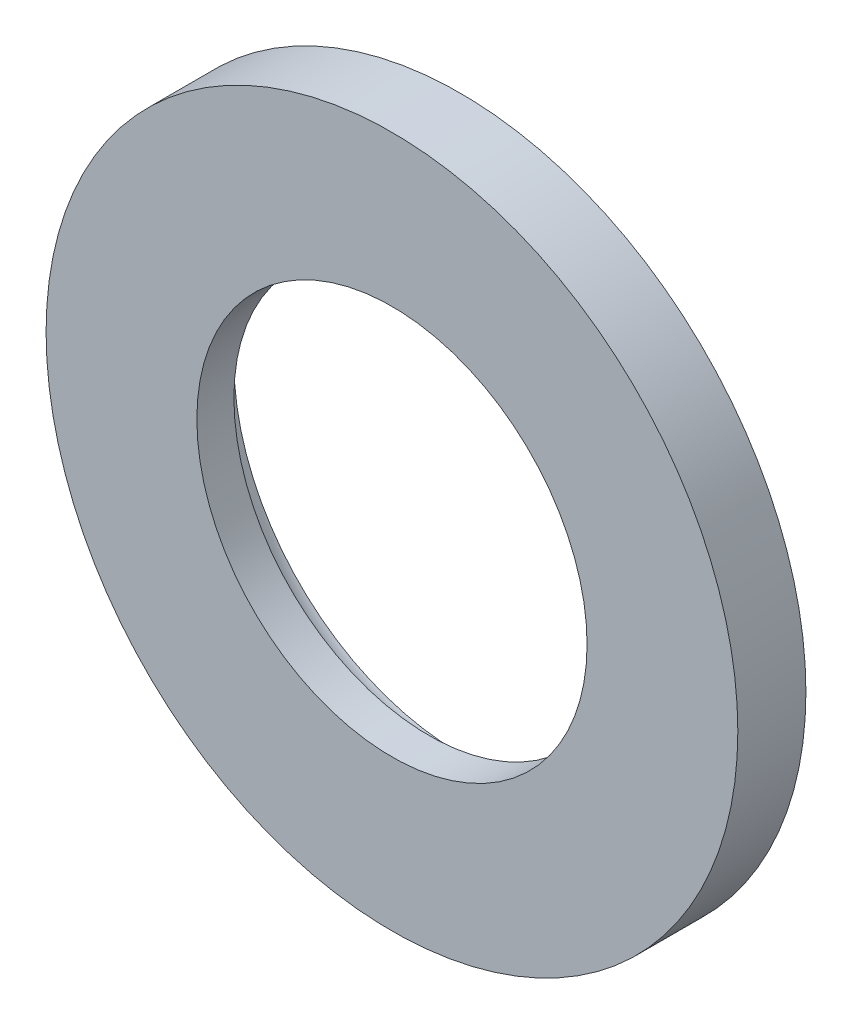
ISO-10303-21;
HEADER;
FILE_DESCRIPTION(('STEP AP214'),'2;1');
FILE_NAME('part.step','',(''),(''),'','','');
FILE_SCHEMA(('AUTOMOTIVE_DESIGN { 1 0 10303 214 1 1 1 1 }'));
ENDSEC;
DATA;
#1=APPLICATION_CONTEXT('core data for automotive mechanical design processes');
#2=APPLICATION_PROTOCOL_DEFINITION('international standard','automotive_design',2000,#1);
#3=PRODUCT_CONTEXT('',#1,'mechanical');
#4=PRODUCT('Part','Part','',(#3));
#5=PRODUCT_RELATED_PRODUCT_CATEGORY('part','',(#4));
#6=PRODUCT_DEFINITION_FORMATION('','',#4);
#7=PRODUCT_DEFINITION_CONTEXT('part definition',#1,'design');
#8=PRODUCT_DEFINITION('design','',#6,#7);
#9=PRODUCT_DEFINITION_SHAPE('','',#8);
#10=(LENGTH_UNIT() NAMED_UNIT(*) SI_UNIT(.MILLI.,.METRE.));
#11=(NAMED_UNIT(*) PLANE_ANGLE_UNIT() SI_UNIT($,.RADIAN.));
#12=(NAMED_UNIT(*) SI_UNIT($,.STERADIAN.) SOLID_ANGLE_UNIT());
#13=UNCERTAINTY_MEASURE_WITH_UNIT(LENGTH_MEASURE(1.E-05),#10,'distance_accuracy_value','');
#14=(GEOMETRIC_REPRESENTATION_CONTEXT(3) GLOBAL_UNCERTAINTY_ASSIGNED_CONTEXT((#13)) GLOBAL_UNIT_ASSIGNED_CONTEXT((#10,
#11,#12)) REPRESENTATION_CONTEXT('',''));
#15=CARTESIAN_POINT('',(0.,0.,0.));
#16=DIRECTION('',(0.,0.,1.));
#17=DIRECTION('',(1.,0.,0.));
#18=AXIS2_PLACEMENT_3D('',#15,#16,#17);
#19=CARTESIAN_POINT('',(0.,0.,-1.95));
#20=DIRECTION('',(0.,0.,1.));
#21=DIRECTION('',(1.,0.,0.));
#22=AXIS2_PLACEMENT_3D('',#19,#20,#21);
#23=CYLINDRICAL_SURFACE('',#22,9.906);
#24=CARTESIAN_POINT('',(0.,0.,-1.95));
#25=DIRECTION('',(0.,0.,1.));
#26=DIRECTION('',(1.,0.,0.));
#27=AXIS2_PLACEMENT_3D('',#24,#25,#26);
#28=CIRCLE('',#27,9.906);
#29=CARTESIAN_POINT('',(9.906,0.,-1.95));
#30=VERTEX_POINT('',#29);
#31=EDGE_CURVE('E43',#30,#30,#28,.T.);
#32=ORIENTED_EDGE('',*,*,#31,.T.);
#33=EDGE_LOOP('',(#32));
#34=FACE_BOUND('',#33,.T.);
#35=CARTESIAN_POINT('',(0.,0.,0.));
#36=DIRECTION('',(0.,0.,1.));
#37=DIRECTION('',(1.,0.,0.));
#38=AXIS2_PLACEMENT_3D('',#35,#36,#37);
#39=CIRCLE('',#38,9.906);
#40=CARTESIAN_POINT('',(9.906,0.,0.));
#41=VERTEX_POINT('',#40);
#42=EDGE_CURVE('E60',#41,#41,#39,.T.);
#43=ORIENTED_EDGE('',*,*,#42,.F.);
#44=EDGE_LOOP('',(#43));
#45=FACE_BOUND('',#44,.T.);
#46=ADVANCED_FACE('F36',(#34,#45),#23,.T.);
#47=CARTESIAN_POINT('',(0.,0.,-1.95));
#48=DIRECTION('',(0.,0.,1.));
#49=DIRECTION('',(1.,0.,0.));
#50=AXIS2_PLACEMENT_3D('',#47,#48,#49);
#51=PLANE('',#50);
#52=CARTESIAN_POINT('',(0.,0.,-1.95));
#53=DIRECTION('',(0.,0.,1.));
#54=DIRECTION('',(1.,0.,0.));
#55=AXIS2_PLACEMENT_3D('',#52,#53,#54);
#56=CIRCLE('',#55,6.477);
#57=CARTESIAN_POINT('',(-6.477,0.,-1.95));
#58=VERTEX_POINT('',#57);
#59=EDGE_CURVE('E53',#58,#58,#56,.T.);
#60=ORIENTED_EDGE('',*,*,#59,.T.);
#61=EDGE_LOOP('',(#60));
#62=FACE_BOUND('',#61,.T.);
#63=ORIENTED_EDGE('',*,*,#31,.F.);
#64=EDGE_LOOP('',(#63));
#65=FACE_BOUND('',#64,.T.);
#66=ADVANCED_FACE('F68',(#62,#65),#51,.F.);
#67=CARTESIAN_POINT('',(0.,0.,0.));
#68=DIRECTION('',(0.,0.,1.));
#69=DIRECTION('',(1.,0.,0.));
#70=AXIS2_PLACEMENT_3D('',#67,#68,#69);
#71=PLANE('',#70);
#72=CARTESIAN_POINT('',(0.,0.,0.));
#73=DIRECTION('',(0.,0.,-1.));
#74=DIRECTION('',(-1.,0.,0.));
#75=AXIS2_PLACEMENT_3D('',#72,#73,#74);
#76=CIRCLE('',#75,5.588);
#77=CARTESIAN_POINT('',(-5.588,0.,0.));
#78=VERTEX_POINT('',#77);
#79=EDGE_CURVE('E55',#78,#78,#76,.T.);
#80=ORIENTED_EDGE('',*,*,#79,.T.);
#81=EDGE_LOOP('',(#80));
#82=FACE_BOUND('',#81,.T.);
#83=ORIENTED_EDGE('',*,*,#42,.T.);
#84=EDGE_LOOP('',(#83));
#85=FACE_BOUND('',#84,.T.);
#86=ADVANCED_FACE('F65',(#82,#85),#71,.T.);
#87=CARTESIAN_POINT('',(0.,0.,-1.95));
#88=DIRECTION('',(0.,0.,-1.));
#89=DIRECTION('',(-1.,0.,0.));
#90=AXIS2_PLACEMENT_3D('',#87,#88,#89);
#91=CYLINDRICAL_SURFACE('',#90,5.588);
#92=CARTESIAN_POINT('',(0.,0.,-1.061));
#93=DIRECTION('',(0.,0.,-1.));
#94=DIRECTION('',(-1.,0.,0.));
#95=AXIS2_PLACEMENT_3D('',#92,#93,#94);
#96=CIRCLE('',#95,5.588);
#97=CARTESIAN_POINT('',(-5.588,0.,-1.061));
#98=VERTEX_POINT('',#97);
#99=EDGE_CURVE('E11',#98,#98,#96,.T.);
#100=ORIENTED_EDGE('',*,*,#99,.T.);
#101=EDGE_LOOP('',(#100));
#102=FACE_BOUND('',#101,.T.);
#103=ORIENTED_EDGE('',*,*,#79,.F.);
#104=EDGE_LOOP('',(#103));
#105=FACE_BOUND('',#104,.T.);
#106=ADVANCED_FACE('F80',(#102,#105),#91,.F.);
#107=CARTESIAN_POINT('',(0.,0.,-1.95));
#108=DIRECTION('',(0.,0.,-1.));
#109=DIRECTION('',(-1.,0.,0.));
#110=AXIS2_PLACEMENT_3D('',#107,#108,#109);
#111=TOROIDAL_SURFACE('',#110,5.588,0.889);
#112=CARTESIAN_POINT('',(-5.588,0.,-1.95));
#113=DIRECTION('',(0.,1.,0.));
#114=DIRECTION('',(0.,0.,1.));
#115=AXIS2_PLACEMENT_3D('',#112,#113,#114);
#116=CIRCLE('',#115,0.889);
#117=EDGE_CURVE('E50',#58,#98,#116,.T.);
#118=ORIENTED_EDGE('',*,*,#117,.T.);
#119=ORIENTED_EDGE('',*,*,#99,.F.);
#120=ORIENTED_EDGE('',*,*,#117,.F.);
#121=ORIENTED_EDGE('',*,*,#59,.F.);
#122=EDGE_LOOP('',(#118,#119,#120,#121));
#123=FACE_BOUND('',#122,.T.);
#124=ADVANCED_FACE('F51',(#123),#111,.F.);
#125=CLOSED_SHELL('',(#46,#66,#86,#106,#124));
#126=MANIFOLD_SOLID_BREP('B2',#125);
#127=ADVANCED_BREP_SHAPE_REPRESENTATION('',(#18,#126),#14);
#128=SHAPE_DEFINITION_REPRESENTATION(#9,#127);
ENDSEC;
END-ISO-10303-21;
